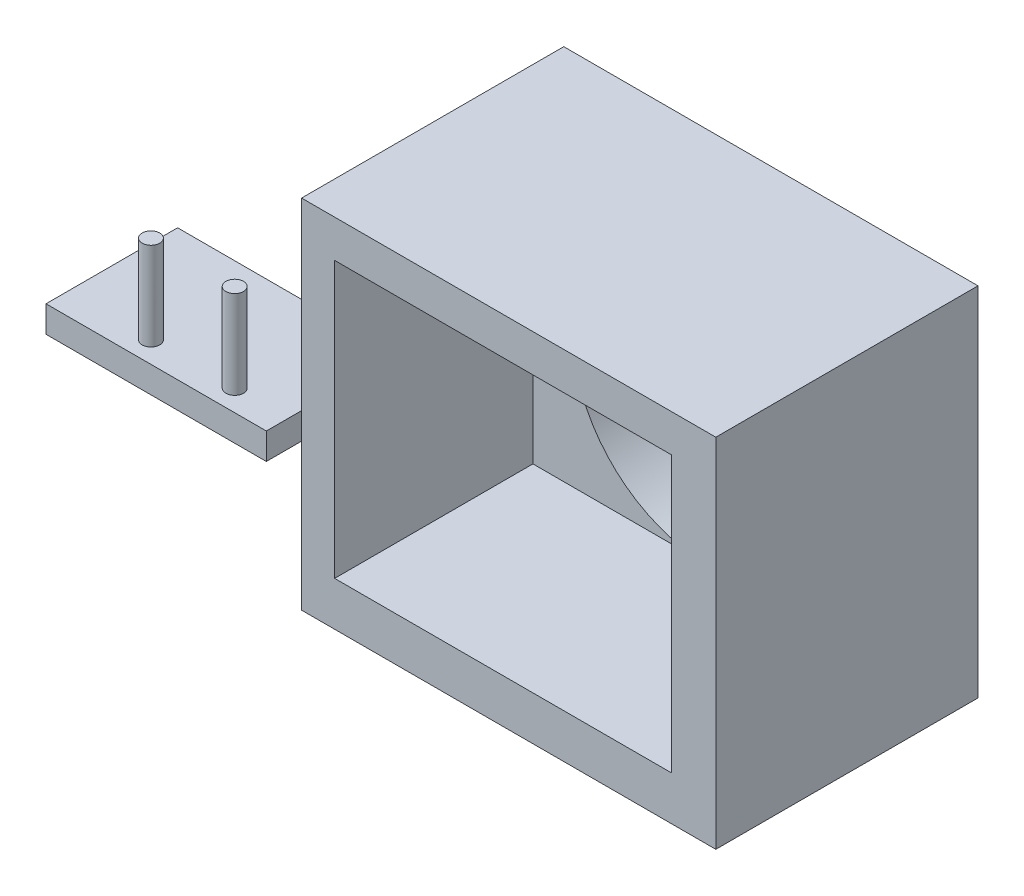
ISO-10303-21;
HEADER;
FILE_DESCRIPTION(('STEP AP214'),'2;1');
FILE_NAME('part.step','',(''),(''),'','','');
FILE_SCHEMA(('AUTOMOTIVE_DESIGN { 1 0 10303 214 1 1 1 1 }'));
ENDSEC;
DATA;
#1=APPLICATION_CONTEXT('core data for automotive mechanical design processes');
#2=APPLICATION_PROTOCOL_DEFINITION('international standard','automotive_design',2000,#1);
#3=PRODUCT_CONTEXT('',#1,'mechanical');
#4=PRODUCT('Part','Part','',(#3));
#5=PRODUCT_RELATED_PRODUCT_CATEGORY('part','',(#4));
#6=PRODUCT_DEFINITION_FORMATION('','',#4);
#7=PRODUCT_DEFINITION_CONTEXT('part definition',#1,'design');
#8=PRODUCT_DEFINITION('design','',#6,#7);
#9=PRODUCT_DEFINITION_SHAPE('','',#8);
#10=(LENGTH_UNIT() NAMED_UNIT(*) SI_UNIT(.MILLI.,.METRE.));
#11=(NAMED_UNIT(*) PLANE_ANGLE_UNIT() SI_UNIT($,.RADIAN.));
#12=(NAMED_UNIT(*) SI_UNIT($,.STERADIAN.) SOLID_ANGLE_UNIT());
#13=UNCERTAINTY_MEASURE_WITH_UNIT(LENGTH_MEASURE(1.E-05),#10,'distance_accuracy_value','');
#14=(GEOMETRIC_REPRESENTATION_CONTEXT(3) GLOBAL_UNCERTAINTY_ASSIGNED_CONTEXT((#13)) GLOBAL_UNIT_ASSIGNED_CONTEXT((#10,
#11,#12)) REPRESENTATION_CONTEXT('',''));
#15=CARTESIAN_POINT('',(0.,0.,0.));
#16=DIRECTION('',(0.,0.,1.));
#17=DIRECTION('',(1.,0.,0.));
#18=AXIS2_PLACEMENT_3D('',#15,#16,#17);
#19=CARTESIAN_POINT('',(1.25692750992854,54.4363006596743,0.));
#20=DIRECTION('',(0.,1.,0.));
#21=DIRECTION('',(0.,0.,1.));
#22=AXIS2_PLACEMENT_3D('',#19,#20,#21);
#23=PLANE('',#22);
#24=DIRECTION('',(-1.,0.,0.));
#25=VECTOR('',#24,1.);
#26=CARTESIAN_POINT('',(1.25692750992854,54.4363006596743,25.));
#27=LINE('',#26,#25);
#28=CARTESIAN_POINT('',(1.25692750992854,54.4363006596743,25.));
#29=VERTEX_POINT('',#28);
#30=CARTESIAN_POINT('',(-45.7430724900715,54.4363006596743,25.));
#31=VERTEX_POINT('',#30);
#32=EDGE_CURVE('E276',#29,#31,#27,.T.);
#33=ORIENTED_EDGE('',*,*,#32,.F.);
#34=DIRECTION('',(0.,0.,1.));
#35=VECTOR('',#34,1.);
#36=CARTESIAN_POINT('',(1.25692750992854,54.4363006596743,0.));
#37=LINE('',#36,#35);
#38=CARTESIAN_POINT('',(1.25692750992854,54.4363006596743,-4.75));
#39=VERTEX_POINT('',#38);
#40=EDGE_CURVE('E293',#39,#29,#37,.T.);
#41=ORIENTED_EDGE('',*,*,#40,.F.);
#42=DIRECTION('',(1.,0.,0.));
#43=VECTOR('',#42,1.);
#44=CARTESIAN_POINT('',(1.25692750992854,54.4363006596743,-4.75));
#45=LINE('',#44,#43);
#46=CARTESIAN_POINT('',(-45.7430724900715,54.4363006596743,-4.75));
#47=VERTEX_POINT('',#46);
#48=EDGE_CURVE('E207',#47,#39,#45,.T.);
#49=ORIENTED_EDGE('',*,*,#48,.F.);
#50=DIRECTION('',(0.,0.,1.));
#51=VECTOR('',#50,1.);
#52=CARTESIAN_POINT('',(-45.7430724900715,54.4363006596743,0.));
#53=LINE('',#52,#51);
#54=EDGE_CURVE('E292',#47,#31,#53,.T.);
#55=ORIENTED_EDGE('',*,*,#54,.T.);
#56=EDGE_LOOP('',(#33,#41,#49,#55));
#57=FACE_BOUND('',#56,.T.);
#58=ADVANCED_FACE('F45',(#57),#23,.T.);
#59=CARTESIAN_POINT('',(1.25692750992854,13.9363006596743,0.));
#60=DIRECTION('',(1.,0.,0.));
#61=DIRECTION('',(0.,0.,-1.));
#62=AXIS2_PLACEMENT_3D('',#59,#60,#61);
#63=PLANE('',#62);
#64=DIRECTION('',(0.,1.,0.));
#65=VECTOR('',#64,1.);
#66=CARTESIAN_POINT('',(1.25692750992854,13.9363006596743,25.));
#67=LINE('',#66,#65);
#68=CARTESIAN_POINT('',(1.25692750992854,13.9363006596743,25.));
#69=VERTEX_POINT('',#68);
#70=EDGE_CURVE('E288',#69,#29,#67,.T.);
#71=ORIENTED_EDGE('',*,*,#70,.F.);
#72=DIRECTION('',(0.,0.,1.));
#73=VECTOR('',#72,1.);
#74=CARTESIAN_POINT('',(1.25692750992854,13.9363006596743,0.));
#75=LINE('',#74,#73);
#76=CARTESIAN_POINT('',(1.25692750992854,13.9363006596743,-4.75));
#77=VERTEX_POINT('',#76);
#78=EDGE_CURVE('E296',#77,#69,#75,.T.);
#79=ORIENTED_EDGE('',*,*,#78,.F.);
#80=DIRECTION('',(0.,-1.,0.));
#81=VECTOR('',#80,1.);
#82=CARTESIAN_POINT('',(1.25692750992854,54.4363006596743,-4.75));
#83=LINE('',#82,#81);
#84=EDGE_CURVE('E195',#39,#77,#83,.T.);
#85=ORIENTED_EDGE('',*,*,#84,.F.);
#86=ORIENTED_EDGE('',*,*,#40,.T.);
#87=EDGE_LOOP('',(#71,#79,#85,#86));
#88=FACE_BOUND('',#87,.T.);
#89=ADVANCED_FACE('F362',(#88),#63,.T.);
#90=CARTESIAN_POINT('',(-45.7430724900715,13.9363006596743,0.));
#91=DIRECTION('',(0.,-1.,0.));
#92=DIRECTION('',(0.,0.,-1.));
#93=AXIS2_PLACEMENT_3D('',#90,#91,#92);
#94=PLANE('',#93);
#95=DIRECTION('',(1.,0.,0.));
#96=VECTOR('',#95,1.);
#97=CARTESIAN_POINT('',(-45.7430724900715,13.9363006596743,25.));
#98=LINE('',#97,#96);
#99=CARTESIAN_POINT('',(-45.7430724900715,13.9363006596743,25.));
#100=VERTEX_POINT('',#99);
#101=EDGE_CURVE('E284',#100,#69,#98,.T.);
#102=ORIENTED_EDGE('',*,*,#101,.F.);
#103=DIRECTION('',(0.,0.,1.));
#104=VECTOR('',#103,1.);
#105=CARTESIAN_POINT('',(-45.7430724900715,13.9363006596743,0.));
#106=LINE('',#105,#104);
#107=CARTESIAN_POINT('',(-45.7430724900715,13.9363006596743,-4.75));
#108=VERTEX_POINT('',#107);
#109=EDGE_CURVE('E299',#108,#100,#106,.T.);
#110=ORIENTED_EDGE('',*,*,#109,.F.);
#111=DIRECTION('',(-1.,0.,0.));
#112=VECTOR('',#111,1.);
#113=CARTESIAN_POINT('',(1.25692750992854,13.9363006596743,-4.75));
#114=LINE('',#113,#112);
#115=EDGE_CURVE('E199',#77,#108,#114,.T.);
#116=ORIENTED_EDGE('',*,*,#115,.F.);
#117=ORIENTED_EDGE('',*,*,#78,.T.);
#118=EDGE_LOOP('',(#102,#110,#116,#117));
#119=FACE_BOUND('',#118,.T.);
#120=ADVANCED_FACE('F359',(#119),#94,.T.);
#121=CARTESIAN_POINT('',(-45.7430724900715,54.4363006596743,0.));
#122=DIRECTION('',(-1.,0.,0.));
#123=DIRECTION('',(0.,0.,1.));
#124=AXIS2_PLACEMENT_3D('',#121,#122,#123);
#125=PLANE('',#124);
#126=DIRECTION('',(0.,0.,1.));
#127=VECTOR('',#126,1.);
#128=CARTESIAN_POINT('',(-45.7430724900715,30.5463006596743,25.));
#129=LINE('',#128,#127);
#130=CARTESIAN_POINT('',(-45.7430724900715,30.5463006596743,14.066148471072));
#131=VERTEX_POINT('',#130);
#132=CARTESIAN_POINT('',(-45.7430724900715,30.5463006596743,25.));
#133=VERTEX_POINT('',#132);
#134=EDGE_CURVE('E258',#131,#133,#129,.T.);
#135=ORIENTED_EDGE('',*,*,#134,.F.);
#136=DIRECTION('',(0.,-1.,0.));
#137=VECTOR('',#136,1.);
#138=CARTESIAN_POINT('',(-45.7430724900715,30.5463006596743,14.066148471072));
#139=LINE('',#138,#137);
#140=CARTESIAN_POINT('',(-45.7430724900715,33.5463006596743,14.066148471072));
#141=VERTEX_POINT('',#140);
#142=EDGE_CURVE('E264',#141,#131,#139,.T.);
#143=ORIENTED_EDGE('',*,*,#142,.F.);
#144=DIRECTION('',(0.,0.,-1.));
#145=VECTOR('',#144,1.);
#146=CARTESIAN_POINT('',(-45.7430724900715,33.5463006596743,14.066148471072));
#147=LINE('',#146,#145);
#148=CARTESIAN_POINT('',(-45.7430724900715,33.5463006596743,25.));
#149=VERTEX_POINT('',#148);
#150=EDGE_CURVE('E246',#149,#141,#147,.T.);
#151=ORIENTED_EDGE('',*,*,#150,.F.);
#152=DIRECTION('',(0.,-1.,0.));
#153=VECTOR('',#152,1.);
#154=CARTESIAN_POINT('',(-45.7430724900715,54.4363006596743,25.));
#155=LINE('',#154,#153);
#156=EDGE_CURVE('E281',#31,#149,#155,.T.);
#157=ORIENTED_EDGE('',*,*,#156,.F.);
#158=ORIENTED_EDGE('',*,*,#54,.F.);
#159=DIRECTION('',(0.,1.,0.));
#160=VECTOR('',#159,1.);
#161=CARTESIAN_POINT('',(-45.7430724900715,54.4363006596743,-4.75));
#162=LINE('',#161,#160);
#163=EDGE_CURVE('E203',#108,#47,#162,.T.);
#164=ORIENTED_EDGE('',*,*,#163,.F.);
#165=ORIENTED_EDGE('',*,*,#109,.T.);
#166=EDGE_CURVE('E280',#133,#100,#155,.T.);
#167=ORIENTED_EDGE('',*,*,#166,.F.);
#168=EDGE_LOOP('',(#135,#143,#151,#157,#158,#164,#165,#167));
#169=FACE_BOUND('',#168,.T.);
#170=ADVANCED_FACE('F330',(#169),#125,.T.);
#171=CARTESIAN_POINT('',(0.,0.,25.));
#172=DIRECTION('',(0.,0.,1.));
#173=DIRECTION('',(1.,0.,0.));
#174=AXIS2_PLACEMENT_3D('',#171,#172,#173);
#175=PLANE('',#174);
#176=DIRECTION('',(0.,1.,0.));
#177=VECTOR('',#176,1.);
#178=CARTESIAN_POINT('',(-45.7430724900715,30.5463006596743,25.));
#179=LINE('',#178,#177);
#180=EDGE_CURVE('E185',#133,#149,#179,.T.);
#181=ORIENTED_EDGE('',*,*,#180,.F.);
#182=ORIENTED_EDGE('',*,*,#166,.T.);
#183=ORIENTED_EDGE('',*,*,#101,.T.);
#184=ORIENTED_EDGE('',*,*,#70,.T.);
#185=ORIENTED_EDGE('',*,*,#32,.T.);
#186=ORIENTED_EDGE('',*,*,#156,.T.);
#187=EDGE_LOOP('',(#181,#182,#183,#184,#185,#186));
#188=FACE_BOUND('',#187,.T.);
#189=DIRECTION('',(0.,1.,0.));
#190=VECTOR('',#189,1.);
#191=CARTESIAN_POINT('',(-3.74307249007146,18.9363006596743,25.));
#192=LINE('',#191,#190);
#193=CARTESIAN_POINT('',(-3.74307249007146,18.9363006596743,25.));
#194=VERTEX_POINT('',#193);
#195=CARTESIAN_POINT('',(-3.74307249007146,50.1863006596743,25.));
#196=VERTEX_POINT('',#195);
#197=EDGE_CURVE('E65',#194,#196,#192,.T.);
#198=ORIENTED_EDGE('',*,*,#197,.F.);
#199=DIRECTION('',(1.,0.,0.));
#200=VECTOR('',#199,1.);
#201=CARTESIAN_POINT('',(-41.9930724900715,18.9363006596743,25.));
#202=LINE('',#201,#200);
#203=CARTESIAN_POINT('',(-41.9930724900715,18.9363006596743,25.));
#204=VERTEX_POINT('',#203);
#205=EDGE_CURVE('E216',#204,#194,#202,.T.);
#206=ORIENTED_EDGE('',*,*,#205,.F.);
#207=DIRECTION('',(0.,-1.,0.));
#208=VECTOR('',#207,1.);
#209=CARTESIAN_POINT('',(-41.9930724900715,50.1863006596743,25.));
#210=LINE('',#209,#208);
#211=CARTESIAN_POINT('',(-41.9930724900715,50.1863006596743,25.));
#212=VERTEX_POINT('',#211);
#213=EDGE_CURVE('E236',#212,#204,#210,.T.);
#214=ORIENTED_EDGE('',*,*,#213,.F.);
#215=DIRECTION('',(-1.,0.,0.));
#216=VECTOR('',#215,1.);
#217=CARTESIAN_POINT('',(-3.74307249007146,50.1863006596743,25.));
#218=LINE('',#217,#216);
#219=EDGE_CURVE('E232',#196,#212,#218,.T.);
#220=ORIENTED_EDGE('',*,*,#219,.F.);
#221=EDGE_LOOP('',(#198,#206,#214,#220));
#222=FACE_BOUND('',#221,.T.);
#223=ADVANCED_FACE('F316',(#188,#222),#175,.T.);
#224=CARTESIAN_POINT('',(-70.7430724900715,33.5463006596743,14.066148471072));
#225=DIRECTION('',(0.,-1.,0.));
#226=DIRECTION('',(0.,0.,-1.));
#227=AXIS2_PLACEMENT_3D('',#224,#225,#226);
#228=PLANE('',#227);
#229=CARTESIAN_POINT('',(-61.2430724900715,33.5463006596743,26.5904470533132));
#230=DIRECTION('',(0.,-1.,0.));
#231=DIRECTION('',(0.,0.,-1.));
#232=AXIS2_PLACEMENT_3D('',#229,#230,#231);
#233=CIRCLE('',#232,0.999999999999998);
#234=CARTESIAN_POINT('',(-61.2430724900715,33.5463006596743,25.5904470533133));
#235=VERTEX_POINT('',#234);
#236=EDGE_CURVE('E11',#235,#235,#233,.F.);
#237=ORIENTED_EDGE('',*,*,#236,.F.);
#238=EDGE_LOOP('',(#237));
#239=FACE_BOUND('',#238,.T.);
#240=CARTESIAN_POINT('',(-51.7430724900715,33.5463006596743,26.5904470533132));
#241=DIRECTION('',(0.,-1.,0.));
#242=DIRECTION('',(0.,0.,-1.));
#243=AXIS2_PLACEMENT_3D('',#240,#241,#242);
#244=CIRCLE('',#243,0.999999999999998);
#245=CARTESIAN_POINT('',(-51.7430724900715,33.5463006596743,25.5904470533133));
#246=VERTEX_POINT('',#245);
#247=EDGE_CURVE('E53',#246,#246,#244,.F.);
#248=ORIENTED_EDGE('',*,*,#247,.F.);
#249=EDGE_LOOP('',(#248));
#250=FACE_BOUND('',#249,.T.);
#251=ORIENTED_EDGE('',*,*,#150,.T.);
#252=DIRECTION('',(1.,0.,0.));
#253=VECTOR('',#252,1.);
#254=CARTESIAN_POINT('',(-70.7430724900715,33.5463006596743,14.066148471072));
#255=LINE('',#254,#253);
#256=CARTESIAN_POINT('',(-70.7430724900715,33.5463006596743,14.066148471072));
#257=VERTEX_POINT('',#256);
#258=EDGE_CURVE('E272',#257,#141,#255,.T.);
#259=ORIENTED_EDGE('',*,*,#258,.F.);
#260=DIRECTION('',(0.,0.,-1.));
#261=VECTOR('',#260,1.);
#262=CARTESIAN_POINT('',(-70.7430724900715,33.5463006596743,14.066148471072));
#263=LINE('',#262,#261);
#264=CARTESIAN_POINT('',(-70.7430724900715,33.5463006596743,29.));
#265=VERTEX_POINT('',#264);
#266=EDGE_CURVE('E255',#265,#257,#263,.T.);
#267=ORIENTED_EDGE('',*,*,#266,.F.);
#268=DIRECTION('',(1.,0.,0.));
#269=VECTOR('',#268,1.);
#270=CARTESIAN_POINT('',(-45.7430724900715,33.5463006596743,29.));
#271=LINE('',#270,#269);
#272=CARTESIAN_POINT('',(-45.7430724900715,33.5463006596743,29.));
#273=VERTEX_POINT('',#272);
#274=EDGE_CURVE('E162',#265,#273,#271,.T.);
#275=ORIENTED_EDGE('',*,*,#274,.T.);
#276=DIRECTION('',(0.,0.,-1.));
#277=VECTOR('',#276,1.);
#278=CARTESIAN_POINT('',(-45.7430724900715,33.5463006596743,25.));
#279=LINE('',#278,#277);
#280=EDGE_CURVE('E171',#273,#149,#279,.T.);
#281=ORIENTED_EDGE('',*,*,#280,.T.);
#282=EDGE_LOOP('',(#251,#259,#267,#275,#281));
#283=FACE_BOUND('',#282,.T.);
#284=ADVANCED_FACE('F312',(#239,#250,#283),#228,.F.);
#285=CARTESIAN_POINT('',(-70.7430724900715,30.5463006596743,14.066148471072));
#286=DIRECTION('',(0.,0.,1.));
#287=DIRECTION('',(1.,0.,0.));
#288=AXIS2_PLACEMENT_3D('',#285,#286,#287);
#289=PLANE('',#288);
#290=ORIENTED_EDGE('',*,*,#142,.T.);
#291=DIRECTION('',(1.,0.,0.));
#292=VECTOR('',#291,1.);
#293=CARTESIAN_POINT('',(-70.7430724900715,30.5463006596743,14.066148471072));
#294=LINE('',#293,#292);
#295=CARTESIAN_POINT('',(-70.7430724900715,30.5463006596743,14.066148471072));
#296=VERTEX_POINT('',#295);
#297=EDGE_CURVE('E154',#296,#131,#294,.T.);
#298=ORIENTED_EDGE('',*,*,#297,.F.);
#299=DIRECTION('',(0.,-1.,0.));
#300=VECTOR('',#299,1.);
#301=CARTESIAN_POINT('',(-70.7430724900715,30.5463006596743,14.066148471072));
#302=LINE('',#301,#300);
#303=EDGE_CURVE('E148',#257,#296,#302,.T.);
#304=ORIENTED_EDGE('',*,*,#303,.F.);
#305=ORIENTED_EDGE('',*,*,#258,.T.);
#306=EDGE_LOOP('',(#290,#298,#304,#305));
#307=FACE_BOUND('',#306,.T.);
#308=ADVANCED_FACE('F315',(#307),#289,.F.);
#309=CARTESIAN_POINT('',(-70.7430724900715,30.5463006596743,25.));
#310=DIRECTION('',(0.,1.,0.));
#311=DIRECTION('',(0.,0.,1.));
#312=AXIS2_PLACEMENT_3D('',#309,#310,#311);
#313=PLANE('',#312);
#314=ORIENTED_EDGE('',*,*,#134,.T.);
#315=DIRECTION('',(0.,0.,-1.));
#316=VECTOR('',#315,1.);
#317=CARTESIAN_POINT('',(-45.7430724900715,30.5463006596743,25.));
#318=LINE('',#317,#316);
#319=CARTESIAN_POINT('',(-45.7430724900715,30.5463006596743,29.));
#320=VERTEX_POINT('',#319);
#321=EDGE_CURVE('E165',#320,#133,#318,.T.);
#322=ORIENTED_EDGE('',*,*,#321,.F.);
#323=DIRECTION('',(1.,0.,0.));
#324=VECTOR('',#323,1.);
#325=CARTESIAN_POINT('',(-45.7430724900715,30.5463006596743,29.));
#326=LINE('',#325,#324);
#327=CARTESIAN_POINT('',(-70.7430724900715,30.5463006596743,29.));
#328=VERTEX_POINT('',#327);
#329=EDGE_CURVE('E159',#328,#320,#326,.T.);
#330=ORIENTED_EDGE('',*,*,#329,.F.);
#331=DIRECTION('',(0.,0.,1.));
#332=VECTOR('',#331,1.);
#333=CARTESIAN_POINT('',(-70.7430724900715,30.5463006596743,25.));
#334=LINE('',#333,#332);
#335=EDGE_CURVE('E142',#296,#328,#334,.T.);
#336=ORIENTED_EDGE('',*,*,#335,.F.);
#337=ORIENTED_EDGE('',*,*,#297,.T.);
#338=EDGE_LOOP('',(#314,#322,#330,#336,#337));
#339=FACE_BOUND('',#338,.T.);
#340=ADVANCED_FACE('F168',(#339),#313,.F.);
#341=CARTESIAN_POINT('',(-70.7430724900715,0.,0.));
#342=DIRECTION('',(1.,0.,0.));
#343=DIRECTION('',(0.,0.,-1.));
#344=AXIS2_PLACEMENT_3D('',#341,#342,#343);
#345=PLANE('',#344);
#346=ORIENTED_EDGE('',*,*,#335,.T.);
#347=DIRECTION('',(0.,1.,0.));
#348=VECTOR('',#347,1.);
#349=CARTESIAN_POINT('',(-70.7430724900715,30.5463006596743,29.));
#350=LINE('',#349,#348);
#351=EDGE_CURVE('E145',#328,#265,#350,.T.);
#352=ORIENTED_EDGE('',*,*,#351,.T.);
#353=ORIENTED_EDGE('',*,*,#266,.T.);
#354=ORIENTED_EDGE('',*,*,#303,.T.);
#355=EDGE_LOOP('',(#346,#352,#353,#354));
#356=FACE_BOUND('',#355,.T.);
#357=ADVANCED_FACE('F144',(#356),#345,.F.);
#358=CARTESIAN_POINT('',(-3.74307249007146,18.9363006596743,2.5));
#359=DIRECTION('',(1.,0.,0.));
#360=DIRECTION('',(0.,1.,0.));
#361=AXIS2_PLACEMENT_3D('',#358,#359,#360);
#362=PLANE('',#361);
#363=ORIENTED_EDGE('',*,*,#197,.T.);
#364=DIRECTION('',(0.,0.,1.));
#365=VECTOR('',#364,1.);
#366=CARTESIAN_POINT('',(-3.74307249007146,50.1863006596743,2.5));
#367=LINE('',#366,#365);
#368=CARTESIAN_POINT('',(-3.74307249007146,50.1863006596743,2.5));
#369=VERTEX_POINT('',#368);
#370=EDGE_CURVE('E229',#369,#196,#367,.T.);
#371=ORIENTED_EDGE('',*,*,#370,.F.);
#372=DIRECTION('',(0.,1.,0.));
#373=VECTOR('',#372,1.);
#374=CARTESIAN_POINT('',(-3.74307249007146,18.9363006596743,2.5));
#375=LINE('',#374,#373);
#376=CARTESIAN_POINT('',(-3.74307249007146,18.9363006596743,2.5));
#377=VERTEX_POINT('',#376);
#378=EDGE_CURVE('E211',#377,#369,#375,.T.);
#379=ORIENTED_EDGE('',*,*,#378,.F.);
#380=DIRECTION('',(0.,0.,1.));
#381=VECTOR('',#380,1.);
#382=CARTESIAN_POINT('',(-3.74307249007146,18.9363006596743,2.5));
#383=LINE('',#382,#381);
#384=EDGE_CURVE('E243',#377,#194,#383,.T.);
#385=ORIENTED_EDGE('',*,*,#384,.T.);
#386=EDGE_LOOP('',(#363,#371,#379,#385));
#387=FACE_BOUND('',#386,.T.);
#388=ADVANCED_FACE('F344',(#387),#362,.F.);
#389=CARTESIAN_POINT('',(-41.9930724900715,18.9363006596743,2.5));
#390=DIRECTION('',(0.,-1.,0.));
#391=DIRECTION('',(1.,0.,0.));
#392=AXIS2_PLACEMENT_3D('',#389,#390,#391);
#393=PLANE('',#392);
#394=DIRECTION('',(1.,0.,0.));
#395=VECTOR('',#394,1.);
#396=CARTESIAN_POINT('',(-41.9930724900715,18.9363006596743,2.5));
#397=LINE('',#396,#395);
#398=CARTESIAN_POINT('',(-22.2430724900715,18.9363006596743,2.5));
#399=VERTEX_POINT('',#398);
#400=EDGE_CURVE('E224',#399,#377,#397,.T.);
#401=ORIENTED_EDGE('',*,*,#400,.F.);
#402=CARTESIAN_POINT('',(-41.9930724900715,18.9363006596743,2.5));
#403=VERTEX_POINT('',#402);
#404=EDGE_CURVE('E225',#403,#399,#397,.T.);
#405=ORIENTED_EDGE('',*,*,#404,.F.);
#406=DIRECTION('',(0.,0.,1.));
#407=VECTOR('',#406,1.);
#408=CARTESIAN_POINT('',(-41.9930724900715,18.9363006596743,2.5));
#409=LINE('',#408,#407);
#410=EDGE_CURVE('E247',#403,#204,#409,.T.);
#411=ORIENTED_EDGE('',*,*,#410,.T.);
#412=ORIENTED_EDGE('',*,*,#205,.T.);
#413=ORIENTED_EDGE('',*,*,#384,.F.);
#414=EDGE_LOOP('',(#401,#405,#411,#412,#413));
#415=FACE_BOUND('',#414,.T.);
#416=ADVANCED_FACE('F342',(#415),#393,.F.);
#417=CARTESIAN_POINT('',(-41.9930724900715,50.1863006596743,2.5));
#418=DIRECTION('',(-1.,0.,0.));
#419=DIRECTION('',(0.,-1.,0.));
#420=AXIS2_PLACEMENT_3D('',#417,#418,#419);
#421=PLANE('',#420);
#422=ORIENTED_EDGE('',*,*,#213,.T.);
#423=ORIENTED_EDGE('',*,*,#410,.F.);
#424=DIRECTION('',(0.,-1.,0.));
#425=VECTOR('',#424,1.);
#426=CARTESIAN_POINT('',(-41.9930724900715,50.1863006596743,2.5));
#427=LINE('',#426,#425);
#428=CARTESIAN_POINT('',(-41.9930724900715,50.1863006596743,2.5));
#429=VERTEX_POINT('',#428);
#430=EDGE_CURVE('E220',#429,#403,#427,.T.);
#431=ORIENTED_EDGE('',*,*,#430,.F.);
#432=DIRECTION('',(0.,0.,1.));
#433=VECTOR('',#432,1.);
#434=CARTESIAN_POINT('',(-41.9930724900715,50.1863006596743,2.5));
#435=LINE('',#434,#433);
#436=EDGE_CURVE('E250',#429,#212,#435,.T.);
#437=ORIENTED_EDGE('',*,*,#436,.T.);
#438=EDGE_LOOP('',(#422,#423,#431,#437));
#439=FACE_BOUND('',#438,.T.);
#440=ADVANCED_FACE('F352',(#439),#421,.F.);
#441=CARTESIAN_POINT('',(-3.74307249007146,50.1863006596743,2.5));
#442=DIRECTION('',(0.,1.,0.));
#443=DIRECTION('',(-1.,0.,0.));
#444=AXIS2_PLACEMENT_3D('',#441,#442,#443);
#445=PLANE('',#444);
#446=ORIENTED_EDGE('',*,*,#219,.T.);
#447=ORIENTED_EDGE('',*,*,#436,.F.);
#448=DIRECTION('',(-1.,0.,0.));
#449=VECTOR('',#448,1.);
#450=CARTESIAN_POINT('',(-3.74307249007146,50.1863006596743,2.5));
#451=LINE('',#450,#449);
#452=EDGE_CURVE('E215',#369,#429,#451,.T.);
#453=ORIENTED_EDGE('',*,*,#452,.F.);
#454=ORIENTED_EDGE('',*,*,#370,.T.);
#455=EDGE_LOOP('',(#446,#447,#453,#454));
#456=FACE_BOUND('',#455,.T.);
#457=ADVANCED_FACE('F348',(#456),#445,.F.);
#458=CARTESIAN_POINT('',(0.,0.,2.5));
#459=DIRECTION('',(0.,0.,1.));
#460=DIRECTION('',(1.,0.,0.));
#461=AXIS2_PLACEMENT_3D('',#458,#459,#460);
#462=PLANE('',#461);
#463=ORIENTED_EDGE('',*,*,#404,.T.);
#464=CARTESIAN_POINT('',(-22.2430724900715,34.1863006596743,2.5));
#465=DIRECTION('',(0.,0.,1.));
#466=DIRECTION('',(1.,0.,0.));
#467=AXIS2_PLACEMENT_3D('',#464,#465,#466);
#468=CIRCLE('',#467,15.25);
#469=EDGE_CURVE('E58',#399,#399,#468,.T.);
#470=ORIENTED_EDGE('',*,*,#469,.F.);
#471=ORIENTED_EDGE('',*,*,#400,.T.);
#472=ORIENTED_EDGE('',*,*,#378,.T.);
#473=ORIENTED_EDGE('',*,*,#452,.T.);
#474=ORIENTED_EDGE('',*,*,#430,.T.);
#475=EDGE_LOOP('',(#463,#470,#471,#472,#473,#474));
#476=FACE_BOUND('',#475,.T.);
#477=ADVANCED_FACE('F338',(#476),#462,.T.);
#478=CARTESIAN_POINT('',(-22.2430724900715,34.1863006596743,10.));
#479=DIRECTION('',(0.,0.,-1.));
#480=DIRECTION('',(-1.,0.,0.));
#481=AXIS2_PLACEMENT_3D('',#478,#479,#480);
#482=CYLINDRICAL_SURFACE('',#481,15.25);
#483=ORIENTED_EDGE('',*,*,#469,.T.);
#484=EDGE_LOOP('',(#483));
#485=FACE_BOUND('',#484,.T.);
#486=CARTESIAN_POINT('',(-22.2430724900715,34.1863006596743,-4.75));
#487=DIRECTION('',(0.,0.,-1.));
#488=DIRECTION('',(-1.,0.,0.));
#489=AXIS2_PLACEMENT_3D('',#486,#487,#488);
#490=CIRCLE('',#489,15.25);
#491=CARTESIAN_POINT('',(-37.4930724900715,34.1863006596743,-4.75));
#492=VERTEX_POINT('',#491);
#493=EDGE_CURVE('E189',#492,#492,#490,.T.);
#494=ORIENTED_EDGE('',*,*,#493,.T.);
#495=EDGE_LOOP('',(#494));
#496=FACE_BOUND('',#495,.T.);
#497=ADVANCED_FACE('F389',(#485,#496),#482,.F.);
#498=CARTESIAN_POINT('',(0.,0.,-4.75));
#499=DIRECTION('',(0.,0.,-1.));
#500=DIRECTION('',(-1.,0.,0.));
#501=AXIS2_PLACEMENT_3D('',#498,#499,#500);
#502=PLANE('',#501);
#503=ORIENTED_EDGE('',*,*,#84,.T.);
#504=ORIENTED_EDGE('',*,*,#115,.T.);
#505=ORIENTED_EDGE('',*,*,#163,.T.);
#506=ORIENTED_EDGE('',*,*,#48,.T.);
#507=EDGE_LOOP('',(#503,#504,#505,#506));
#508=FACE_BOUND('',#507,.T.);
#509=ORIENTED_EDGE('',*,*,#493,.F.);
#510=EDGE_LOOP('',(#509));
#511=FACE_BOUND('',#510,.T.);
#512=ADVANCED_FACE('F375',(#508,#511),#502,.T.);
#513=CARTESIAN_POINT('',(-45.7430724900715,30.5463006596743,25.));
#514=DIRECTION('',(1.,0.,0.));
#515=DIRECTION('',(0.,0.,-1.));
#516=AXIS2_PLACEMENT_3D('',#513,#514,#515);
#517=PLANE('',#516);
#518=ORIENTED_EDGE('',*,*,#280,.F.);
#519=DIRECTION('',(0.,1.,0.));
#520=VECTOR('',#519,1.);
#521=CARTESIAN_POINT('',(-45.7430724900715,30.5463006596743,29.));
#522=LINE('',#521,#520);
#523=EDGE_CURVE('E164',#320,#273,#522,.T.);
#524=ORIENTED_EDGE('',*,*,#523,.F.);
#525=ORIENTED_EDGE('',*,*,#321,.T.);
#526=ORIENTED_EDGE('',*,*,#180,.T.);
#527=EDGE_LOOP('',(#518,#524,#525,#526));
#528=FACE_BOUND('',#527,.T.);
#529=ADVANCED_FACE('F327',(#528),#517,.T.);
#530=CARTESIAN_POINT('',(-45.7430724900715,30.5463006596743,29.));
#531=DIRECTION('',(0.,0.,1.));
#532=DIRECTION('',(1.,0.,0.));
#533=AXIS2_PLACEMENT_3D('',#530,#531,#532);
#534=PLANE('',#533);
#535=ORIENTED_EDGE('',*,*,#274,.F.);
#536=ORIENTED_EDGE('',*,*,#351,.F.);
#537=ORIENTED_EDGE('',*,*,#329,.T.);
#538=ORIENTED_EDGE('',*,*,#523,.T.);
#539=EDGE_LOOP('',(#535,#536,#537,#538));
#540=FACE_BOUND('',#539,.T.);
#541=ADVANCED_FACE('F158',(#540),#534,.T.);
#542=CARTESIAN_POINT('',(-51.7430724900715,43.5463006596743,26.5904470533132));
#543=DIRECTION('',(0.,-1.,0.));
#544=DIRECTION('',(0.,0.,-1.));
#545=AXIS2_PLACEMENT_3D('',#542,#543,#544);
#546=CYLINDRICAL_SURFACE('',#545,0.999999999999998);
#547=CARTESIAN_POINT('',(-51.7430724900715,43.5463006596743,26.5904470533132));
#548=DIRECTION('',(0.,1.,0.));
#549=DIRECTION('',(0.,0.,1.));
#550=AXIS2_PLACEMENT_3D('',#547,#548,#549);
#551=CIRCLE('',#550,0.999999999999998);
#552=CARTESIAN_POINT('',(-51.7430724900715,43.5463006596743,27.5904470533132));
#553=VERTEX_POINT('',#552);
#554=EDGE_CURVE('E179',#553,#553,#551,.T.);
#555=ORIENTED_EDGE('',*,*,#554,.F.);
#556=EDGE_LOOP('',(#555));
#557=FACE_BOUND('',#556,.T.);
#558=ORIENTED_EDGE('',*,*,#247,.T.);
#559=EDGE_LOOP('',(#558));
#560=FACE_BOUND('',#559,.T.);
#561=ADVANCED_FACE('F310',(#557,#560),#546,.T.);
#562=CARTESIAN_POINT('',(-51.7430724900715,43.5463006596743,26.5904470533132));
#563=DIRECTION('',(0.,1.,0.));
#564=DIRECTION('',(0.,0.,1.));
#565=AXIS2_PLACEMENT_3D('',#562,#563,#564);
#566=PLANE('',#565);
#567=ORIENTED_EDGE('',*,*,#554,.T.);
#568=EDGE_LOOP('',(#567));
#569=FACE_BOUND('',#568,.T.);
#570=ADVANCED_FACE('F534',(#569),#566,.T.);
#571=CARTESIAN_POINT('',(-61.2430724900715,43.5463006596743,26.5904470533132));
#572=DIRECTION('',(0.,-1.,0.));
#573=DIRECTION('',(0.,0.,-1.));
#574=AXIS2_PLACEMENT_3D('',#571,#572,#573);
#575=CYLINDRICAL_SURFACE('',#574,0.999999999999998);
#576=CARTESIAN_POINT('',(-61.2430724900715,43.5463006596743,26.5904470533132));
#577=DIRECTION('',(0.,1.,0.));
#578=DIRECTION('',(0.,0.,1.));
#579=AXIS2_PLACEMENT_3D('',#576,#577,#578);
#580=CIRCLE('',#579,0.999999999999998);
#581=CARTESIAN_POINT('',(-61.2430724900715,43.5463006596743,27.5904470533132));
#582=VERTEX_POINT('',#581);
#583=EDGE_CURVE('E183',#582,#582,#580,.T.);
#584=ORIENTED_EDGE('',*,*,#583,.F.);
#585=EDGE_LOOP('',(#584));
#586=FACE_BOUND('',#585,.T.);
#587=ORIENTED_EDGE('',*,*,#236,.T.);
#588=EDGE_LOOP('',(#587));
#589=FACE_BOUND('',#588,.T.);
#590=ADVANCED_FACE('F543',(#586,#589),#575,.T.);
#591=CARTESIAN_POINT('',(-61.2430724900715,43.5463006596743,26.5904470533132));
#592=DIRECTION('',(0.,1.,0.));
#593=DIRECTION('',(0.,0.,1.));
#594=AXIS2_PLACEMENT_3D('',#591,#592,#593);
#595=PLANE('',#594);
#596=ORIENTED_EDGE('',*,*,#583,.T.);
#597=EDGE_LOOP('',(#596));
#598=FACE_BOUND('',#597,.T.);
#599=ADVANCED_FACE('F552',(#598),#595,.T.);
#600=CLOSED_SHELL('',(#58,#89,#120,#170,#223,#284,#308,#340,#357,#388,#416,#440,#457,#477,#497,
#512,#529,#541,#561,#570,#590,#599));
#601=MANIFOLD_SOLID_BREP('B2',#600);
#602=ADVANCED_BREP_SHAPE_REPRESENTATION('',(#18,#601),#14);
#603=SHAPE_DEFINITION_REPRESENTATION(#9,#602);
ENDSEC;
END-ISO-10303-21;
